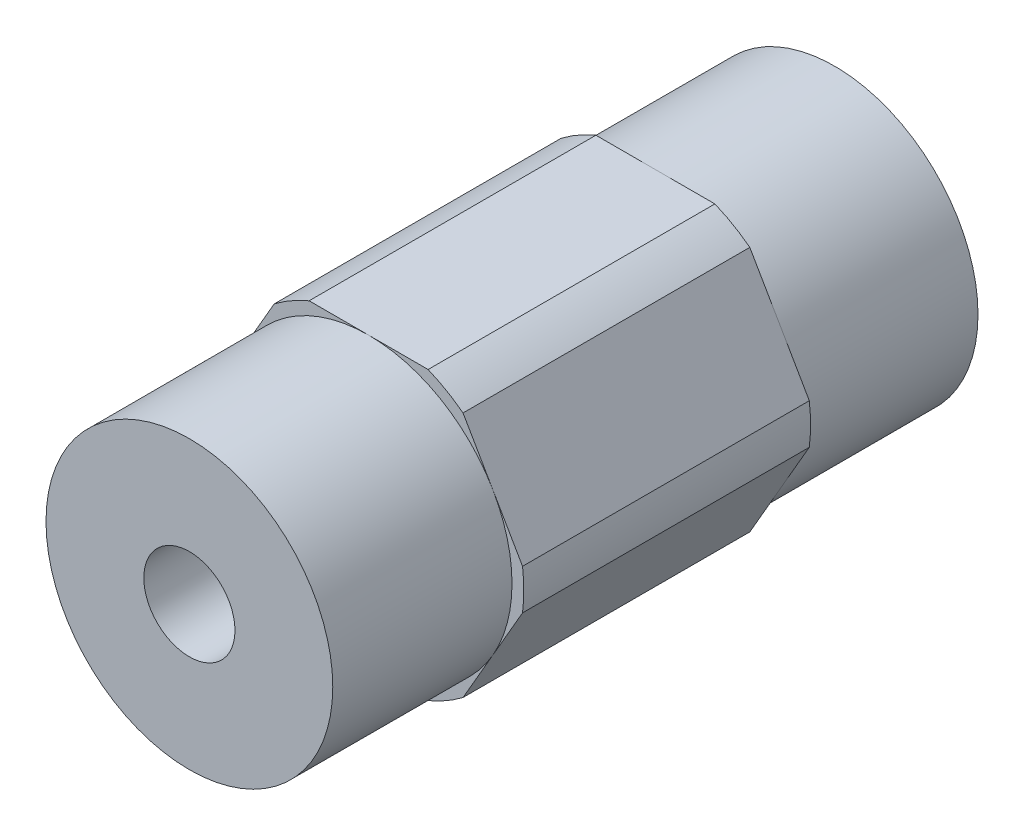
ISO-10303-21;
HEADER;
FILE_DESCRIPTION(('STEP AP214'),'2;1');
FILE_NAME('part.step','',(''),(''),'','','');
FILE_SCHEMA(('AUTOMOTIVE_DESIGN { 1 0 10303 214 1 1 1 1 }'));
ENDSEC;
DATA;
#1=APPLICATION_CONTEXT('core data for automotive mechanical design processes');
#2=APPLICATION_PROTOCOL_DEFINITION('international standard','automotive_design',2000,#1);
#3=PRODUCT_CONTEXT('',#1,'mechanical');
#4=PRODUCT('Part','Part','',(#3));
#5=PRODUCT_RELATED_PRODUCT_CATEGORY('part','',(#4));
#6=PRODUCT_DEFINITION_FORMATION('','',#4);
#7=PRODUCT_DEFINITION_CONTEXT('part definition',#1,'design');
#8=PRODUCT_DEFINITION('design','',#6,#7);
#9=PRODUCT_DEFINITION_SHAPE('','',#8);
#10=(LENGTH_UNIT() NAMED_UNIT(*) SI_UNIT(.MILLI.,.METRE.));
#11=(NAMED_UNIT(*) PLANE_ANGLE_UNIT() SI_UNIT($,.RADIAN.));
#12=(NAMED_UNIT(*) SI_UNIT($,.STERADIAN.) SOLID_ANGLE_UNIT());
#13=UNCERTAINTY_MEASURE_WITH_UNIT(LENGTH_MEASURE(1.E-05),#10,'distance_accuracy_value','');
#14=(GEOMETRIC_REPRESENTATION_CONTEXT(3) GLOBAL_UNCERTAINTY_ASSIGNED_CONTEXT((#13)) GLOBAL_UNIT_ASSIGNED_CONTEXT((#10,
#11,#12)) REPRESENTATION_CONTEXT('',''));
#15=CARTESIAN_POINT('',(0.,0.,0.));
#16=DIRECTION('',(0.,0.,1.));
#17=DIRECTION('',(1.,0.,0.));
#18=AXIS2_PLACEMENT_3D('',#15,#16,#17);
#19=CARTESIAN_POINT('',(0.,0.,-14.2875));
#20=DIRECTION('',(0.,0.,1.));
#21=DIRECTION('',(1.,0.,0.));
#22=AXIS2_PLACEMENT_3D('',#19,#20,#21);
#23=PLANE('',#22);
#24=CARTESIAN_POINT('',(0.,0.,-14.2875));
#25=DIRECTION('',(0.,0.,1.));
#26=DIRECTION('',(1.,0.,0.));
#27=AXIS2_PLACEMENT_3D('',#24,#25,#26);
#28=CIRCLE('',#27,2.0193);
#29=CARTESIAN_POINT('',(2.0193,0.,-14.2875));
#30=VERTEX_POINT('',#29);
#31=EDGE_CURVE('E263',#30,#30,#28,.T.);
#32=ORIENTED_EDGE('',*,*,#31,.T.);
#33=EDGE_LOOP('',(#32));
#34=FACE_BOUND('',#33,.T.);
#35=CARTESIAN_POINT('',(0.,0.,-14.2875));
#36=DIRECTION('',(0.,0.,1.));
#37=DIRECTION('',(1.,0.,0.));
#38=AXIS2_PLACEMENT_3D('',#35,#36,#37);
#39=CIRCLE('',#38,6.35);
#40=CARTESIAN_POINT('',(6.35,0.,-14.2875));
#41=VERTEX_POINT('',#40);
#42=EDGE_CURVE('E73',#41,#41,#39,.F.);
#43=ORIENTED_EDGE('',*,*,#42,.T.);
#44=EDGE_LOOP('',(#43));
#45=FACE_BOUND('',#44,.T.);
#46=ADVANCED_FACE('F65',(#34,#45),#23,.F.);
#47=CARTESIAN_POINT('',(5.49926131403115,3.17499999999999,14.2875));
#48=DIRECTION('',(-0.866025403784438,-0.500000000000001,0.));
#49=DIRECTION('',(0.500000000000001,-0.866025403784438,0.));
#50=AXIS2_PLACEMENT_3D('',#47,#48,#49);
#51=PLANE('',#50);
#52=DIRECTION('',(0.,0.,-1.));
#53=VECTOR('',#52,1.);
#54=CARTESIAN_POINT('',(6.81675178197584,0.89303957103209,14.2875));
#55=LINE('',#54,#53);
#56=CARTESIAN_POINT('',(6.81675178197584,0.89303957103209,6.35));
#57=VERTEX_POINT('',#56);
#58=CARTESIAN_POINT('',(6.81675178197584,0.89303957103209,-6.35));
#59=VERTEX_POINT('',#58);
#60=EDGE_CURVE('E222',#57,#59,#55,.T.);
#61=ORIENTED_EDGE('',*,*,#60,.T.);
#62=DIRECTION('',(-0.500000000000001,0.866025403784438,0.));
#63=VECTOR('',#62,1.);
#64=CARTESIAN_POINT('',(5.49926131403115,3.17499999999999,-6.35));
#65=LINE('',#64,#63);
#66=CARTESIAN_POINT('',(5.49926131403118,3.17500000000001,-6.35));
#67=VERTEX_POINT('',#66);
#68=EDGE_CURVE('E80',#59,#67,#65,.T.);
#69=ORIENTED_EDGE('',*,*,#68,.T.);
#70=CARTESIAN_POINT('',(4.18177084608646,5.45696042896789,-6.35));
#71=VERTEX_POINT('',#70);
#72=EDGE_CURVE('E191',#67,#71,#65,.T.);
#73=ORIENTED_EDGE('',*,*,#72,.T.);
#74=DIRECTION('',(0.,0.,-1.));
#75=VECTOR('',#74,1.);
#76=CARTESIAN_POINT('',(4.18177084608646,5.45696042896789,14.2875));
#77=LINE('',#76,#75);
#78=CARTESIAN_POINT('',(4.18177084608646,5.45696042896789,6.35));
#79=VERTEX_POINT('',#78);
#80=EDGE_CURVE('E297',#79,#71,#77,.T.);
#81=ORIENTED_EDGE('',*,*,#80,.F.);
#82=DIRECTION('',(-0.500000000000001,0.866025403784438,0.));
#83=VECTOR('',#82,1.);
#84=CARTESIAN_POINT('',(5.49926131403115,3.17499999999999,6.35));
#85=LINE('',#84,#83);
#86=CARTESIAN_POINT('',(5.49926131403118,3.17500000000001,6.35));
#87=VERTEX_POINT('',#86);
#88=EDGE_CURVE('E257',#87,#79,#85,.T.);
#89=ORIENTED_EDGE('',*,*,#88,.F.);
#90=EDGE_CURVE('E259',#57,#87,#85,.T.);
#91=ORIENTED_EDGE('',*,*,#90,.F.);
#92=EDGE_LOOP('',(#61,#69,#73,#81,#89,#91));
#93=FACE_BOUND('',#92,.T.);
#94=ADVANCED_FACE('F219',(#93),#51,.F.);
#95=CARTESIAN_POINT('',(0.,0.,14.2875));
#96=DIRECTION('',(0.,0.,-1.));
#97=DIRECTION('',(-1.,0.,0.));
#98=AXIS2_PLACEMENT_3D('',#95,#96,#97);
#99=CYLINDRICAL_SURFACE('',#98,6.874999966);
#100=ORIENTED_EDGE('',*,*,#80,.T.);
#101=CARTESIAN_POINT('',(0.,0.,-6.35));
#102=DIRECTION('',(0.,0.,1.));
#103=DIRECTION('',(1.,0.,0.));
#104=AXIS2_PLACEMENT_3D('',#101,#102,#103);
#105=CIRCLE('',#104,6.874999966);
#106=CARTESIAN_POINT('',(2.63498093588936,6.34999999999997,-6.35));
#107=VERTEX_POINT('',#106);
#108=EDGE_CURVE('E197',#71,#107,#105,.T.);
#109=ORIENTED_EDGE('',*,*,#108,.T.);
#110=DIRECTION('',(0.,0.,-1.));
#111=VECTOR('',#110,1.);
#112=CARTESIAN_POINT('',(2.63498093588936,6.34999999999997,14.2875));
#113=LINE('',#112,#111);
#114=CARTESIAN_POINT('',(2.63498093588936,6.34999999999997,6.35));
#115=VERTEX_POINT('',#114);
#116=EDGE_CURVE('E294',#115,#107,#113,.T.);
#117=ORIENTED_EDGE('',*,*,#116,.F.);
#118=CARTESIAN_POINT('',(0.,0.,6.35));
#119=DIRECTION('',(0.,0.,1.));
#120=DIRECTION('',(1.,0.,0.));
#121=AXIS2_PLACEMENT_3D('',#118,#119,#120);
#122=CIRCLE('',#121,6.874999966);
#123=EDGE_CURVE('E255',#79,#115,#122,.T.);
#124=ORIENTED_EDGE('',*,*,#123,.F.);
#125=EDGE_LOOP('',(#100,#109,#117,#124));
#126=FACE_BOUND('',#125,.T.);
#127=ADVANCED_FACE('F322',(#126),#99,.T.);
#128=CARTESIAN_POINT('',(0.,6.34999999999996,14.2875));
#129=DIRECTION('',(0.,-1.,0.));
#130=DIRECTION('',(1.,0.,0.));
#131=AXIS2_PLACEMENT_3D('',#128,#129,#130);
#132=PLANE('',#131);
#133=ORIENTED_EDGE('',*,*,#116,.T.);
#134=DIRECTION('',(-1.,0.,0.));
#135=VECTOR('',#134,1.);
#136=CARTESIAN_POINT('',(0.,6.34999999999996,-6.35));
#137=LINE('',#136,#135);
#138=CARTESIAN_POINT('',(0.,6.35,-6.35));
#139=VERTEX_POINT('',#138);
#140=EDGE_CURVE('E361',#107,#139,#137,.T.);
#141=ORIENTED_EDGE('',*,*,#140,.T.);
#142=CARTESIAN_POINT('',(-2.6349809358894,6.34999999999995,-6.35));
#143=VERTEX_POINT('',#142);
#144=EDGE_CURVE('E364',#139,#143,#137,.T.);
#145=ORIENTED_EDGE('',*,*,#144,.T.);
#146=DIRECTION('',(0.,0.,-1.));
#147=VECTOR('',#146,1.);
#148=CARTESIAN_POINT('',(-2.6349809358894,6.34999999999995,14.2875));
#149=LINE('',#148,#147);
#150=CARTESIAN_POINT('',(-2.6349809358894,6.34999999999995,6.35));
#151=VERTEX_POINT('',#150);
#152=EDGE_CURVE('E291',#151,#143,#149,.T.);
#153=ORIENTED_EDGE('',*,*,#152,.F.);
#154=DIRECTION('',(-1.,0.,0.));
#155=VECTOR('',#154,1.);
#156=CARTESIAN_POINT('',(0.,6.34999999999996,6.35));
#157=LINE('',#156,#155);
#158=CARTESIAN_POINT('',(0.,6.35,6.35));
#159=VERTEX_POINT('',#158);
#160=EDGE_CURVE('E252',#159,#151,#157,.T.);
#161=ORIENTED_EDGE('',*,*,#160,.F.);
#162=EDGE_CURVE('E254',#115,#159,#157,.T.);
#163=ORIENTED_EDGE('',*,*,#162,.F.);
#164=EDGE_LOOP('',(#133,#141,#145,#153,#161,#163));
#165=FACE_BOUND('',#164,.T.);
#166=ADVANCED_FACE('F329',(#165),#132,.F.);
#167=ORIENTED_EDGE('',*,*,#152,.T.);
#168=CARTESIAN_POINT('',(0.,0.,-6.35));
#169=DIRECTION('',(0.,0.,1.));
#170=DIRECTION('',(1.,0.,0.));
#171=AXIS2_PLACEMENT_3D('',#168,#169,#170);
#172=CIRCLE('',#171,6.874999966);
#173=CARTESIAN_POINT('',(-4.18177084608649,5.45696042896786,-6.35));
#174=VERTEX_POINT('',#173);
#175=EDGE_CURVE('E365',#143,#174,#172,.T.);
#176=ORIENTED_EDGE('',*,*,#175,.T.);
#177=DIRECTION('',(0.,0.,-1.));
#178=VECTOR('',#177,1.);
#179=CARTESIAN_POINT('',(-4.18177084608649,5.45696042896786,14.2875));
#180=LINE('',#179,#178);
#181=CARTESIAN_POINT('',(-4.18177084608649,5.45696042896786,6.35));
#182=VERTEX_POINT('',#181);
#183=EDGE_CURVE('E288',#182,#174,#180,.T.);
#184=ORIENTED_EDGE('',*,*,#183,.F.);
#185=CARTESIAN_POINT('',(0.,0.,6.35));
#186=DIRECTION('',(0.,0.,1.));
#187=DIRECTION('',(1.,0.,0.));
#188=AXIS2_PLACEMENT_3D('',#185,#186,#187);
#189=CIRCLE('',#188,6.874999966);
#190=EDGE_CURVE('E250',#151,#182,#189,.T.);
#191=ORIENTED_EDGE('',*,*,#190,.F.);
#192=EDGE_LOOP('',(#167,#176,#184,#191));
#193=FACE_BOUND('',#192,.T.);
#194=ADVANCED_FACE('F331',(#193),#99,.T.);
#195=CARTESIAN_POINT('',(-5.49926131403117,3.17499999999995,14.2875));
#196=DIRECTION('',(0.866025403784442,-0.499999999999995,0.));
#197=DIRECTION('',(0.499999999999995,0.866025403784441,0.));
#198=AXIS2_PLACEMENT_3D('',#195,#196,#197);
#199=PLANE('',#198);
#200=ORIENTED_EDGE('',*,*,#183,.T.);
#201=DIRECTION('',(-0.499999999999995,-0.866025403784441,0.));
#202=VECTOR('',#201,1.);
#203=CARTESIAN_POINT('',(-5.49926131403117,3.17499999999995,-6.35));
#204=LINE('',#203,#202);
#205=CARTESIAN_POINT('',(-5.4992613140312,3.17499999999997,-6.35));
#206=VERTEX_POINT('',#205);
#207=EDGE_CURVE('E369',#174,#206,#204,.T.);
#208=ORIENTED_EDGE('',*,*,#207,.T.);
#209=CARTESIAN_POINT('',(-6.81675178197585,0.893039571032039,-6.35));
#210=VERTEX_POINT('',#209);
#211=EDGE_CURVE('E370',#206,#210,#204,.T.);
#212=ORIENTED_EDGE('',*,*,#211,.T.);
#213=DIRECTION('',(0.,0.,-1.));
#214=VECTOR('',#213,1.);
#215=CARTESIAN_POINT('',(-6.81675178197585,0.893039571032039,14.2875));
#216=LINE('',#215,#214);
#217=CARTESIAN_POINT('',(-6.81675178197585,0.893039571032039,6.35));
#218=VERTEX_POINT('',#217);
#219=EDGE_CURVE('E285',#218,#210,#216,.T.);
#220=ORIENTED_EDGE('',*,*,#219,.F.);
#221=DIRECTION('',(-0.499999999999995,-0.866025403784441,0.));
#222=VECTOR('',#221,1.);
#223=CARTESIAN_POINT('',(-5.49926131403117,3.17499999999995,6.35));
#224=LINE('',#223,#222);
#225=CARTESIAN_POINT('',(-5.4992613140312,3.17499999999997,6.35));
#226=VERTEX_POINT('',#225);
#227=EDGE_CURVE('E247',#226,#218,#224,.T.);
#228=ORIENTED_EDGE('',*,*,#227,.F.);
#229=EDGE_CURVE('E249',#182,#226,#224,.T.);
#230=ORIENTED_EDGE('',*,*,#229,.F.);
#231=EDGE_LOOP('',(#200,#208,#212,#220,#228,#230));
#232=FACE_BOUND('',#231,.T.);
#233=ADVANCED_FACE('F348',(#232),#199,.F.);
#234=ORIENTED_EDGE('',*,*,#219,.T.);
#235=CARTESIAN_POINT('',(0.,0.,-6.35));
#236=DIRECTION('',(0.,0.,1.));
#237=DIRECTION('',(1.,0.,0.));
#238=AXIS2_PLACEMENT_3D('',#235,#236,#237);
#239=CIRCLE('',#238,6.874999966);
#240=CARTESIAN_POINT('',(-6.81675178197584,-0.893039571032139,-6.35));
#241=VERTEX_POINT('',#240);
#242=EDGE_CURVE('E373',#210,#241,#239,.T.);
#243=ORIENTED_EDGE('',*,*,#242,.T.);
#244=DIRECTION('',(0.,0.,-1.));
#245=VECTOR('',#244,1.);
#246=CARTESIAN_POINT('',(-6.81675178197584,-0.893039571032139,14.2875));
#247=LINE('',#246,#245);
#248=CARTESIAN_POINT('',(-6.81675178197584,-0.893039571032139,6.35));
#249=VERTEX_POINT('',#248);
#250=EDGE_CURVE('E282',#249,#241,#247,.T.);
#251=ORIENTED_EDGE('',*,*,#250,.F.);
#252=CARTESIAN_POINT('',(0.,0.,6.35));
#253=DIRECTION('',(0.,0.,1.));
#254=DIRECTION('',(1.,0.,0.));
#255=AXIS2_PLACEMENT_3D('',#252,#253,#254);
#256=CIRCLE('',#255,6.874999966);
#257=EDGE_CURVE('E245',#218,#249,#256,.T.);
#258=ORIENTED_EDGE('',*,*,#257,.F.);
#259=EDGE_LOOP('',(#234,#243,#251,#258));
#260=FACE_BOUND('',#259,.T.);
#261=ADVANCED_FACE('F346',(#260),#99,.T.);
#262=CARTESIAN_POINT('',(-5.49926131403113,-3.17500000000003,14.2875));
#263=DIRECTION('',(0.866025403784434,0.500000000000007,0.));
#264=DIRECTION('',(-0.500000000000007,0.866025403784435,0.));
#265=AXIS2_PLACEMENT_3D('',#262,#263,#264);
#266=PLANE('',#265);
#267=ORIENTED_EDGE('',*,*,#250,.T.);
#268=DIRECTION('',(0.500000000000007,-0.866025403784435,0.));
#269=VECTOR('',#268,1.);
#270=CARTESIAN_POINT('',(-5.49926131403113,-3.17500000000003,-6.35));
#271=LINE('',#270,#269);
#272=CARTESIAN_POINT('',(-5.49926131403116,-3.17500000000004,-6.35));
#273=VERTEX_POINT('',#272);
#274=EDGE_CURVE('E376',#241,#273,#271,.T.);
#275=ORIENTED_EDGE('',*,*,#274,.T.);
#276=CARTESIAN_POINT('',(-4.18177084608642,-5.45696042896791,-6.35));
#277=VERTEX_POINT('',#276);
#278=EDGE_CURVE('E377',#273,#277,#271,.T.);
#279=ORIENTED_EDGE('',*,*,#278,.T.);
#280=DIRECTION('',(0.,0.,-1.));
#281=VECTOR('',#280,1.);
#282=CARTESIAN_POINT('',(-4.18177084608642,-5.45696042896791,14.2875));
#283=LINE('',#282,#281);
#284=CARTESIAN_POINT('',(-4.18177084608642,-5.45696042896791,6.35));
#285=VERTEX_POINT('',#284);
#286=EDGE_CURVE('E279',#285,#277,#283,.T.);
#287=ORIENTED_EDGE('',*,*,#286,.F.);
#288=DIRECTION('',(0.500000000000007,-0.866025403784435,0.));
#289=VECTOR('',#288,1.);
#290=CARTESIAN_POINT('',(-5.49926131403113,-3.17500000000003,6.35));
#291=LINE('',#290,#289);
#292=CARTESIAN_POINT('',(-5.49926131403116,-3.17500000000004,6.35));
#293=VERTEX_POINT('',#292);
#294=EDGE_CURVE('E242',#293,#285,#291,.T.);
#295=ORIENTED_EDGE('',*,*,#294,.F.);
#296=EDGE_CURVE('E244',#249,#293,#291,.T.);
#297=ORIENTED_EDGE('',*,*,#296,.F.);
#298=EDGE_LOOP('',(#267,#275,#279,#287,#295,#297));
#299=FACE_BOUND('',#298,.T.);
#300=ADVANCED_FACE('F343',(#299),#266,.F.);
#301=ORIENTED_EDGE('',*,*,#286,.T.);
#302=CARTESIAN_POINT('',(0.,0.,-6.35));
#303=DIRECTION('',(0.,0.,1.));
#304=DIRECTION('',(1.,0.,0.));
#305=AXIS2_PLACEMENT_3D('',#302,#303,#304);
#306=CIRCLE('',#305,6.874999966);
#307=CARTESIAN_POINT('',(-2.63498093588932,-6.34999999999999,-6.35));
#308=VERTEX_POINT('',#307);
#309=EDGE_CURVE('E380',#277,#308,#306,.T.);
#310=ORIENTED_EDGE('',*,*,#309,.T.);
#311=DIRECTION('',(0.,0.,-1.));
#312=VECTOR('',#311,1.);
#313=CARTESIAN_POINT('',(-2.63498093588932,-6.34999999999999,14.2875));
#314=LINE('',#313,#312);
#315=CARTESIAN_POINT('',(-2.63498093588932,-6.34999999999999,6.35));
#316=VERTEX_POINT('',#315);
#317=EDGE_CURVE('E276',#316,#308,#314,.T.);
#318=ORIENTED_EDGE('',*,*,#317,.F.);
#319=CARTESIAN_POINT('',(0.,0.,6.35));
#320=DIRECTION('',(0.,0.,1.));
#321=DIRECTION('',(1.,0.,0.));
#322=AXIS2_PLACEMENT_3D('',#319,#320,#321);
#323=CIRCLE('',#322,6.874999966);
#324=EDGE_CURVE('E240',#285,#316,#323,.T.);
#325=ORIENTED_EDGE('',*,*,#324,.F.);
#326=EDGE_LOOP('',(#301,#310,#318,#325));
#327=FACE_BOUND('',#326,.T.);
#328=ADVANCED_FACE('F341',(#327),#99,.T.);
#329=CARTESIAN_POINT('',(0.,-6.34999999999996,14.2875));
#330=DIRECTION('',(0.,1.,0.));
#331=DIRECTION('',(-1.,0.,0.));
#332=AXIS2_PLACEMENT_3D('',#329,#330,#331);
#333=PLANE('',#332);
#334=ORIENTED_EDGE('',*,*,#317,.T.);
#335=DIRECTION('',(1.,0.,0.));
#336=VECTOR('',#335,1.);
#337=CARTESIAN_POINT('',(0.,-6.34999999999996,-6.35));
#338=LINE('',#337,#336);
#339=CARTESIAN_POINT('',(0.,-6.35,-6.35));
#340=VERTEX_POINT('',#339);
#341=EDGE_CURVE('E383',#308,#340,#338,.T.);
#342=ORIENTED_EDGE('',*,*,#341,.T.);
#343=CARTESIAN_POINT('',(2.63498093588945,-6.34999999999994,-6.35));
#344=VERTEX_POINT('',#343);
#345=EDGE_CURVE('E384',#340,#344,#338,.T.);
#346=ORIENTED_EDGE('',*,*,#345,.T.);
#347=DIRECTION('',(0.,0.,-1.));
#348=VECTOR('',#347,1.);
#349=CARTESIAN_POINT('',(2.63498093588945,-6.34999999999993,14.2875));
#350=LINE('',#349,#348);
#351=CARTESIAN_POINT('',(2.63498093588945,-6.34999999999994,6.35));
#352=VERTEX_POINT('',#351);
#353=EDGE_CURVE('E273',#352,#344,#350,.T.);
#354=ORIENTED_EDGE('',*,*,#353,.F.);
#355=DIRECTION('',(1.,0.,0.));
#356=VECTOR('',#355,1.);
#357=CARTESIAN_POINT('',(0.,-6.34999999999996,6.35));
#358=LINE('',#357,#356);
#359=CARTESIAN_POINT('',(0.,-6.35,6.35));
#360=VERTEX_POINT('',#359);
#361=EDGE_CURVE('E237',#360,#352,#358,.T.);
#362=ORIENTED_EDGE('',*,*,#361,.F.);
#363=EDGE_CURVE('E239',#316,#360,#358,.T.);
#364=ORIENTED_EDGE('',*,*,#363,.F.);
#365=EDGE_LOOP('',(#334,#342,#346,#354,#362,#364));
#366=FACE_BOUND('',#365,.T.);
#367=ADVANCED_FACE('F338',(#366),#333,.F.);
#368=ORIENTED_EDGE('',*,*,#353,.T.);
#369=CARTESIAN_POINT('',(0.,0.,-6.35));
#370=DIRECTION('',(0.,0.,1.));
#371=DIRECTION('',(1.,0.,0.));
#372=AXIS2_PLACEMENT_3D('',#369,#370,#371);
#373=CIRCLE('',#372,6.874999966);
#374=CARTESIAN_POINT('',(4.18177084608655,-5.45696042896781,-6.35));
#375=VERTEX_POINT('',#374);
#376=EDGE_CURVE('E387',#344,#375,#373,.T.);
#377=ORIENTED_EDGE('',*,*,#376,.T.);
#378=DIRECTION('',(0.,0.,-1.));
#379=VECTOR('',#378,1.);
#380=CARTESIAN_POINT('',(4.18177084608655,-5.45696042896782,14.2875));
#381=LINE('',#380,#379);
#382=CARTESIAN_POINT('',(4.18177084608655,-5.45696042896781,6.35));
#383=VERTEX_POINT('',#382);
#384=EDGE_CURVE('E270',#383,#375,#381,.T.);
#385=ORIENTED_EDGE('',*,*,#384,.F.);
#386=CARTESIAN_POINT('',(0.,0.,6.35));
#387=DIRECTION('',(0.,0.,1.));
#388=DIRECTION('',(1.,0.,0.));
#389=AXIS2_PLACEMENT_3D('',#386,#387,#388);
#390=CIRCLE('',#389,6.874999966);
#391=EDGE_CURVE('E235',#352,#383,#390,.T.);
#392=ORIENTED_EDGE('',*,*,#391,.F.);
#393=EDGE_LOOP('',(#368,#377,#385,#392));
#394=FACE_BOUND('',#393,.T.);
#395=ADVANCED_FACE('F336',(#394),#99,.T.);
#396=CARTESIAN_POINT('',(5.49926131403119,-3.17499999999996,14.2875));
#397=DIRECTION('',(-0.866025403784442,0.499999999999995,0.));
#398=DIRECTION('',(-0.499999999999995,-0.866025403784442,0.));
#399=AXIS2_PLACEMENT_3D('',#396,#397,#398);
#400=PLANE('',#399);
#401=ORIENTED_EDGE('',*,*,#384,.T.);
#402=DIRECTION('',(0.499999999999995,0.866025403784442,0.));
#403=VECTOR('',#402,1.);
#404=CARTESIAN_POINT('',(5.49926131403119,-3.17499999999996,-6.35));
#405=LINE('',#404,#403);
#406=CARTESIAN_POINT('',(5.4992613140312,-3.17499999999997,-6.35));
#407=VERTEX_POINT('',#406);
#408=EDGE_CURVE('E390',#375,#407,#405,.T.);
#409=ORIENTED_EDGE('',*,*,#408,.T.);
#410=CARTESIAN_POINT('',(6.81675178197584,-0.893039571032111,-6.35));
#411=VERTEX_POINT('',#410);
#412=EDGE_CURVE('E206',#407,#411,#405,.T.);
#413=ORIENTED_EDGE('',*,*,#412,.T.);
#414=DIRECTION('',(0.,0.,-1.));
#415=VECTOR('',#414,1.);
#416=CARTESIAN_POINT('',(6.81675178197584,-0.893039571032111,14.2875));
#417=LINE('',#416,#415);
#418=CARTESIAN_POINT('',(6.81675178197584,-0.893039571032111,6.35));
#419=VERTEX_POINT('',#418);
#420=EDGE_CURVE('E267',#419,#411,#417,.T.);
#421=ORIENTED_EDGE('',*,*,#420,.F.);
#422=DIRECTION('',(0.499999999999995,0.866025403784442,0.));
#423=VECTOR('',#422,1.);
#424=CARTESIAN_POINT('',(5.49926131403119,-3.17499999999996,6.35));
#425=LINE('',#424,#423);
#426=CARTESIAN_POINT('',(5.4992613140312,-3.17499999999997,6.35));
#427=VERTEX_POINT('',#426);
#428=EDGE_CURVE('E87',#427,#419,#425,.T.);
#429=ORIENTED_EDGE('',*,*,#428,.F.);
#430=EDGE_CURVE('E234',#383,#427,#425,.T.);
#431=ORIENTED_EDGE('',*,*,#430,.F.);
#432=EDGE_LOOP('',(#401,#409,#413,#421,#429,#431));
#433=FACE_BOUND('',#432,.T.);
#434=ADVANCED_FACE('F333',(#433),#400,.F.);
#435=ORIENTED_EDGE('',*,*,#420,.T.);
#436=CARTESIAN_POINT('',(0.,0.,-6.35));
#437=DIRECTION('',(0.,0.,1.));
#438=DIRECTION('',(1.,0.,0.));
#439=AXIS2_PLACEMENT_3D('',#436,#437,#438);
#440=CIRCLE('',#439,6.874999966);
#441=EDGE_CURVE('E12',#411,#59,#440,.T.);
#442=ORIENTED_EDGE('',*,*,#441,.T.);
#443=ORIENTED_EDGE('',*,*,#60,.F.);
#444=CARTESIAN_POINT('',(0.,0.,6.35));
#445=DIRECTION('',(0.,0.,1.));
#446=DIRECTION('',(1.,0.,0.));
#447=AXIS2_PLACEMENT_3D('',#444,#445,#446);
#448=CIRCLE('',#447,6.874999966);
#449=EDGE_CURVE('E302',#419,#57,#448,.T.);
#450=ORIENTED_EDGE('',*,*,#449,.F.);
#451=EDGE_LOOP('',(#435,#442,#443,#450));
#452=FACE_BOUND('',#451,.T.);
#453=ADVANCED_FACE('F332',(#452),#99,.T.);
#454=CARTESIAN_POINT('',(0.,0.,14.2875));
#455=DIRECTION('',(0.,0.,1.));
#456=DIRECTION('',(1.,0.,0.));
#457=AXIS2_PLACEMENT_3D('',#454,#455,#456);
#458=PLANE('',#457);
#459=CARTESIAN_POINT('',(0.,0.,14.2875));
#460=DIRECTION('',(0.,0.,1.));
#461=DIRECTION('',(1.,0.,0.));
#462=AXIS2_PLACEMENT_3D('',#459,#460,#461);
#463=CIRCLE('',#462,2.0193);
#464=CARTESIAN_POINT('',(2.0193,0.,14.2875));
#465=VERTEX_POINT('',#464);
#466=EDGE_CURVE('E260',#465,#465,#463,.T.);
#467=ORIENTED_EDGE('',*,*,#466,.F.);
#468=EDGE_LOOP('',(#467));
#469=FACE_BOUND('',#468,.T.);
#470=CARTESIAN_POINT('',(0.,0.,14.2875));
#471=DIRECTION('',(0.,0.,1.));
#472=DIRECTION('',(1.,0.,0.));
#473=AXIS2_PLACEMENT_3D('',#470,#471,#472);
#474=CIRCLE('',#473,6.35);
#475=CARTESIAN_POINT('',(6.35,0.,14.2875));
#476=VERTEX_POINT('',#475);
#477=EDGE_CURVE('E299',#476,#476,#474,.T.);
#478=ORIENTED_EDGE('',*,*,#477,.T.);
#479=EDGE_LOOP('',(#478));
#480=FACE_BOUND('',#479,.T.);
#481=ADVANCED_FACE('F325',(#469,#480),#458,.T.);
#482=CARTESIAN_POINT('',(0.,0.,14.2875));
#483=DIRECTION('',(0.,0.,-1.));
#484=DIRECTION('',(-1.,0.,0.));
#485=AXIS2_PLACEMENT_3D('',#482,#483,#484);
#486=CYLINDRICAL_SURFACE('',#485,2.0193);
#487=ORIENTED_EDGE('',*,*,#466,.T.);
#488=EDGE_LOOP('',(#487));
#489=FACE_BOUND('',#488,.T.);
#490=ORIENTED_EDGE('',*,*,#31,.F.);
#491=EDGE_LOOP('',(#490));
#492=FACE_BOUND('',#491,.T.);
#493=ADVANCED_FACE('F67',(#489,#492),#486,.F.);
#494=CARTESIAN_POINT('',(0.,0.,6.35));
#495=DIRECTION('',(0.,0.,1.));
#496=DIRECTION('',(1.,0.,0.));
#497=AXIS2_PLACEMENT_3D('',#494,#495,#496);
#498=PLANE('',#497);
#499=ORIENTED_EDGE('',*,*,#90,.T.);
#500=CARTESIAN_POINT('',(0.,0.,6.35));
#501=DIRECTION('',(0.,0.,1.));
#502=DIRECTION('',(1.,0.,0.));
#503=AXIS2_PLACEMENT_3D('',#500,#501,#502);
#504=CIRCLE('',#503,6.35);
#505=EDGE_CURVE('E223',#427,#87,#504,.T.);
#506=ORIENTED_EDGE('',*,*,#505,.F.);
#507=ORIENTED_EDGE('',*,*,#428,.T.);
#508=ORIENTED_EDGE('',*,*,#449,.T.);
#509=EDGE_LOOP('',(#499,#506,#507,#508));
#510=FACE_BOUND('',#509,.T.);
#511=ADVANCED_FACE('F437',(#510),#498,.T.);
#512=ORIENTED_EDGE('',*,*,#88,.T.);
#513=ORIENTED_EDGE('',*,*,#123,.T.);
#514=ORIENTED_EDGE('',*,*,#162,.T.);
#515=EDGE_CURVE('E227',#87,#159,#504,.T.);
#516=ORIENTED_EDGE('',*,*,#515,.F.);
#517=EDGE_LOOP('',(#512,#513,#514,#516));
#518=FACE_BOUND('',#517,.T.);
#519=ADVANCED_FACE('F431',(#518),#498,.T.);
#520=ORIENTED_EDGE('',*,*,#160,.T.);
#521=ORIENTED_EDGE('',*,*,#190,.T.);
#522=ORIENTED_EDGE('',*,*,#229,.T.);
#523=EDGE_CURVE('E232',#159,#226,#504,.T.);
#524=ORIENTED_EDGE('',*,*,#523,.F.);
#525=EDGE_LOOP('',(#520,#521,#522,#524));
#526=FACE_BOUND('',#525,.T.);
#527=ADVANCED_FACE('F420',(#526),#498,.T.);
#528=ORIENTED_EDGE('',*,*,#227,.T.);
#529=ORIENTED_EDGE('',*,*,#257,.T.);
#530=ORIENTED_EDGE('',*,*,#296,.T.);
#531=EDGE_CURVE('E425',#226,#293,#504,.T.);
#532=ORIENTED_EDGE('',*,*,#531,.F.);
#533=EDGE_LOOP('',(#528,#529,#530,#532));
#534=FACE_BOUND('',#533,.T.);
#535=ADVANCED_FACE('F453',(#534),#498,.T.);
#536=ORIENTED_EDGE('',*,*,#294,.T.);
#537=ORIENTED_EDGE('',*,*,#324,.T.);
#538=ORIENTED_EDGE('',*,*,#363,.T.);
#539=EDGE_CURVE('E439',#293,#360,#504,.T.);
#540=ORIENTED_EDGE('',*,*,#539,.F.);
#541=EDGE_LOOP('',(#536,#537,#538,#540));
#542=FACE_BOUND('',#541,.T.);
#543=ADVANCED_FACE('F447',(#542),#498,.T.);
#544=ORIENTED_EDGE('',*,*,#361,.T.);
#545=ORIENTED_EDGE('',*,*,#391,.T.);
#546=ORIENTED_EDGE('',*,*,#430,.T.);
#547=EDGE_CURVE('E225',#360,#427,#504,.T.);
#548=ORIENTED_EDGE('',*,*,#547,.F.);
#549=EDGE_LOOP('',(#544,#545,#546,#548));
#550=FACE_BOUND('',#549,.T.);
#551=ADVANCED_FACE('F435',(#550),#498,.T.);
#552=CARTESIAN_POINT('',(0.,0.,6.35));
#553=DIRECTION('',(0.,0.,1.));
#554=DIRECTION('',(1.,0.,0.));
#555=AXIS2_PLACEMENT_3D('',#552,#553,#554);
#556=CYLINDRICAL_SURFACE('',#555,6.35);
#557=ORIENTED_EDGE('',*,*,#477,.F.);
#558=EDGE_LOOP('',(#557));
#559=FACE_BOUND('',#558,.T.);
#560=ORIENTED_EDGE('',*,*,#505,.T.);
#561=ORIENTED_EDGE('',*,*,#515,.T.);
#562=ORIENTED_EDGE('',*,*,#523,.T.);
#563=ORIENTED_EDGE('',*,*,#531,.T.);
#564=ORIENTED_EDGE('',*,*,#539,.T.);
#565=ORIENTED_EDGE('',*,*,#547,.T.);
#566=EDGE_LOOP('',(#560,#561,#562,#563,#564,#565));
#567=FACE_BOUND('',#566,.T.);
#568=ADVANCED_FACE('F427',(#559,#567),#556,.T.);
#569=CARTESIAN_POINT('',(0.,0.,-6.35));
#570=DIRECTION('',(0.,0.,1.));
#571=DIRECTION('',(1.,0.,0.));
#572=AXIS2_PLACEMENT_3D('',#569,#570,#571);
#573=PLANE('',#572);
#574=ORIENTED_EDGE('',*,*,#441,.F.);
#575=ORIENTED_EDGE('',*,*,#412,.F.);
#576=CARTESIAN_POINT('',(0.,0.,-6.35));
#577=DIRECTION('',(0.,0.,1.));
#578=DIRECTION('',(1.,0.,0.));
#579=AXIS2_PLACEMENT_3D('',#576,#577,#578);
#580=CIRCLE('',#579,6.35);
#581=EDGE_CURVE('E203',#407,#67,#580,.T.);
#582=ORIENTED_EDGE('',*,*,#581,.T.);
#583=ORIENTED_EDGE('',*,*,#68,.F.);
#584=EDGE_LOOP('',(#574,#575,#582,#583));
#585=FACE_BOUND('',#584,.T.);
#586=ADVANCED_FACE('F204',(#585),#573,.F.);
#587=EDGE_CURVE('E194',#67,#139,#580,.T.);
#588=ORIENTED_EDGE('',*,*,#587,.T.);
#589=ORIENTED_EDGE('',*,*,#140,.F.);
#590=ORIENTED_EDGE('',*,*,#108,.F.);
#591=ORIENTED_EDGE('',*,*,#72,.F.);
#592=EDGE_LOOP('',(#588,#589,#590,#591));
#593=FACE_BOUND('',#592,.T.);
#594=ADVANCED_FACE('F192',(#593),#573,.F.);
#595=EDGE_CURVE('E217',#139,#206,#580,.T.);
#596=ORIENTED_EDGE('',*,*,#595,.T.);
#597=ORIENTED_EDGE('',*,*,#207,.F.);
#598=ORIENTED_EDGE('',*,*,#175,.F.);
#599=ORIENTED_EDGE('',*,*,#144,.F.);
#600=EDGE_LOOP('',(#596,#597,#598,#599));
#601=FACE_BOUND('',#600,.T.);
#602=ADVANCED_FACE('F411',(#601),#573,.F.);
#603=EDGE_CURVE('E406',#206,#273,#580,.T.);
#604=ORIENTED_EDGE('',*,*,#603,.T.);
#605=ORIENTED_EDGE('',*,*,#274,.F.);
#606=ORIENTED_EDGE('',*,*,#242,.F.);
#607=ORIENTED_EDGE('',*,*,#211,.F.);
#608=EDGE_LOOP('',(#604,#605,#606,#607));
#609=FACE_BOUND('',#608,.T.);
#610=ADVANCED_FACE('F450',(#609),#573,.F.);
#611=EDGE_CURVE('E403',#273,#340,#580,.T.);
#612=ORIENTED_EDGE('',*,*,#611,.T.);
#613=ORIENTED_EDGE('',*,*,#341,.F.);
#614=ORIENTED_EDGE('',*,*,#309,.F.);
#615=ORIENTED_EDGE('',*,*,#278,.F.);
#616=EDGE_LOOP('',(#612,#613,#614,#615));
#617=FACE_BOUND('',#616,.T.);
#618=ADVANCED_FACE('F312',(#617),#573,.F.);
#619=EDGE_CURVE('E210',#340,#407,#580,.T.);
#620=ORIENTED_EDGE('',*,*,#619,.T.);
#621=ORIENTED_EDGE('',*,*,#408,.F.);
#622=ORIENTED_EDGE('',*,*,#376,.F.);
#623=ORIENTED_EDGE('',*,*,#345,.F.);
#624=EDGE_LOOP('',(#620,#621,#622,#623));
#625=FACE_BOUND('',#624,.T.);
#626=ADVANCED_FACE('F307',(#625),#573,.F.);
#627=CARTESIAN_POINT('',(0.,0.,-6.35));
#628=DIRECTION('',(0.,0.,-1.));
#629=DIRECTION('',(-1.,0.,0.));
#630=AXIS2_PLACEMENT_3D('',#627,#628,#629);
#631=CYLINDRICAL_SURFACE('',#630,6.35);
#632=ORIENTED_EDGE('',*,*,#587,.F.);
#633=ORIENTED_EDGE('',*,*,#581,.F.);
#634=ORIENTED_EDGE('',*,*,#619,.F.);
#635=ORIENTED_EDGE('',*,*,#611,.F.);
#636=ORIENTED_EDGE('',*,*,#603,.F.);
#637=ORIENTED_EDGE('',*,*,#595,.F.);
#638=EDGE_LOOP('',(#632,#633,#634,#635,#636,#637));
#639=FACE_BOUND('',#638,.T.);
#640=ORIENTED_EDGE('',*,*,#42,.F.);
#641=EDGE_LOOP('',(#640));
#642=FACE_BOUND('',#641,.T.);
#643=ADVANCED_FACE('F213',(#639,#642),#631,.T.);
#644=CLOSED_SHELL('',(#46,#94,#127,#166,#194,#233,#261,#300,#328,#367,#395,#434,#453,#481,#493,
#511,#519,#527,#535,#543,#551,#568,#586,#594,#602,#610,#618,#626,#643));
#645=MANIFOLD_SOLID_BREP('B2',#644);
#646=ADVANCED_BREP_SHAPE_REPRESENTATION('',(#18,#645),#14);
#647=SHAPE_DEFINITION_REPRESENTATION(#9,#646);
ENDSEC;
END-ISO-10303-21;
